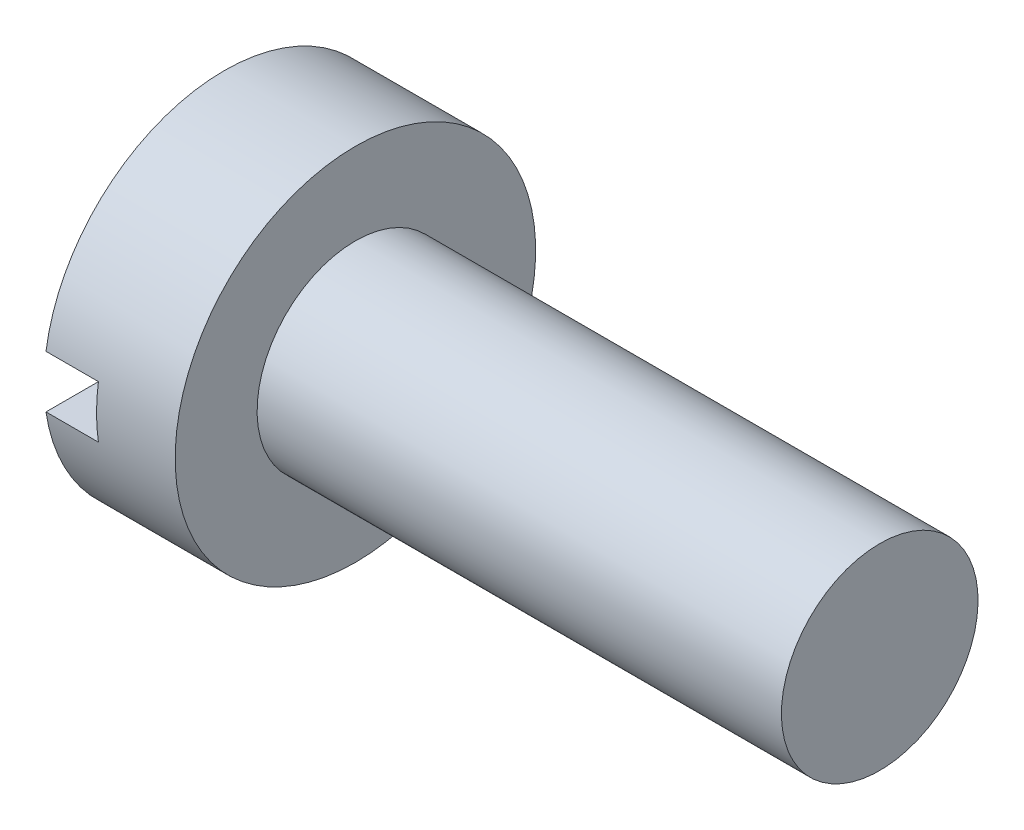
ISO-10303-21;
HEADER;
FILE_DESCRIPTION(('STEP AP214'),'2;1');
FILE_NAME('part.step','',(''),(''),'','','');
FILE_SCHEMA(('AUTOMOTIVE_DESIGN { 1 0 10303 214 1 1 1 1 }'));
ENDSEC;
DATA;
#1=APPLICATION_CONTEXT('core data for automotive mechanical design processes');
#2=APPLICATION_PROTOCOL_DEFINITION('international standard','automotive_design',2000,#1);
#3=PRODUCT_CONTEXT('',#1,'mechanical');
#4=PRODUCT('Part','Part','',(#3));
#5=PRODUCT_RELATED_PRODUCT_CATEGORY('part','',(#4));
#6=PRODUCT_DEFINITION_FORMATION('','',#4);
#7=PRODUCT_DEFINITION_CONTEXT('part definition',#1,'design');
#8=PRODUCT_DEFINITION('design','',#6,#7);
#9=PRODUCT_DEFINITION_SHAPE('','',#8);
#10=(LENGTH_UNIT() NAMED_UNIT(*) SI_UNIT(.MILLI.,.METRE.));
#11=(NAMED_UNIT(*) PLANE_ANGLE_UNIT() SI_UNIT($,.RADIAN.));
#12=(NAMED_UNIT(*) SI_UNIT($,.STERADIAN.) SOLID_ANGLE_UNIT());
#13=UNCERTAINTY_MEASURE_WITH_UNIT(LENGTH_MEASURE(1.E-05),#10,'distance_accuracy_value','');
#14=(GEOMETRIC_REPRESENTATION_CONTEXT(3) GLOBAL_UNCERTAINTY_ASSIGNED_CONTEXT((#13)) GLOBAL_UNIT_ASSIGNED_CONTEXT((#10,
#11,#12)) REPRESENTATION_CONTEXT('',''));
#15=CARTESIAN_POINT('',(0.,0.,0.));
#16=DIRECTION('',(0.,0.,1.));
#17=DIRECTION('',(1.,0.,0.));
#18=AXIS2_PLACEMENT_3D('',#15,#16,#17);
#19=CARTESIAN_POINT('',(0.,0.,0.));
#20=DIRECTION('',(-1.,0.,0.));
#21=DIRECTION('',(0.,-1.,0.));
#22=AXIS2_PLACEMENT_3D('',#19,#20,#21);
#23=PLANE('',#22);
#24=DIRECTION('',(0.,0.,-1.));
#25=VECTOR('',#24,1.);
#26=CARTESIAN_POINT('',(0.,0.399999999999997,-2.75));
#27=LINE('',#26,#25);
#28=CARTESIAN_POINT('',(0.,0.399999999999999,2.72075357208256));
#29=VERTEX_POINT('',#28);
#30=CARTESIAN_POINT('',(0.,0.399999999999997,-2.72075357208256));
#31=VERTEX_POINT('',#30);
#32=EDGE_CURVE('E82',#29,#31,#27,.T.);
#33=ORIENTED_EDGE('',*,*,#32,.F.);
#34=CARTESIAN_POINT('',(0.,0.,0.));
#35=DIRECTION('',(1.,0.,0.));
#36=DIRECTION('',(0.,1.,0.));
#37=AXIS2_PLACEMENT_3D('',#34,#35,#36);
#38=CIRCLE('',#37,2.75);
#39=EDGE_CURVE('E88',#31,#29,#38,.T.);
#40=ORIENTED_EDGE('',*,*,#39,.F.);
#41=EDGE_LOOP('',(#33,#40));
#42=FACE_BOUND('',#41,.T.);
#43=ADVANCED_FACE('F32',(#42),#23,.T.);
#44=DIRECTION('',(0.,0.,1.));
#45=VECTOR('',#44,1.);
#46=CARTESIAN_POINT('',(0.,-0.400000000000001,-2.75));
#47=LINE('',#46,#45);
#48=CARTESIAN_POINT('',(0.,-0.400000000000001,-2.72075357208256));
#49=VERTEX_POINT('',#48);
#50=CARTESIAN_POINT('',(0.,-0.399999999999999,2.72075357208256));
#51=VERTEX_POINT('',#50);
#52=EDGE_CURVE('E76',#49,#51,#47,.T.);
#53=ORIENTED_EDGE('',*,*,#52,.F.);
#54=EDGE_CURVE('E81',#51,#49,#38,.T.);
#55=ORIENTED_EDGE('',*,*,#54,.F.);
#56=EDGE_LOOP('',(#53,#55));
#57=FACE_BOUND('',#56,.T.);
#58=ADVANCED_FACE('F34',(#57),#23,.T.);
#59=CARTESIAN_POINT('',(10.,0.,0.));
#60=DIRECTION('',(1.,0.,0.));
#61=DIRECTION('',(0.,1.,0.));
#62=AXIS2_PLACEMENT_3D('',#59,#60,#61);
#63=CYLINDRICAL_SURFACE('',#62,2.75);
#64=DIRECTION('',(1.,0.,0.));
#65=VECTOR('',#64,1.);
#66=CARTESIAN_POINT('',(10.,0.399999999999997,-2.72075357208256));
#67=LINE('',#66,#65);
#68=CARTESIAN_POINT('',(0.8,0.399999999999997,-2.72075357208256));
#69=VERTEX_POINT('',#68);
#70=EDGE_CURVE('E11',#31,#69,#67,.T.);
#71=ORIENTED_EDGE('',*,*,#70,.F.);
#72=ORIENTED_EDGE('',*,*,#39,.T.);
#73=DIRECTION('',(1.,0.,0.));
#74=VECTOR('',#73,1.);
#75=CARTESIAN_POINT('',(10.,0.399999999999999,2.72075357208256));
#76=LINE('',#75,#74);
#77=CARTESIAN_POINT('',(0.8,0.399999999999999,2.72075357208256));
#78=VERTEX_POINT('',#77);
#79=EDGE_CURVE('E97',#78,#29,#76,.F.);
#80=ORIENTED_EDGE('',*,*,#79,.F.);
#81=CARTESIAN_POINT('',(0.8,0.,0.));
#82=DIRECTION('',(-1.,0.,0.));
#83=DIRECTION('',(0.,0.,1.));
#84=AXIS2_PLACEMENT_3D('',#81,#82,#83);
#85=CIRCLE('',#84,2.75);
#86=CARTESIAN_POINT('',(0.8,-0.399999999999999,2.72075357208256));
#87=VERTEX_POINT('',#86);
#88=EDGE_CURVE('E47',#78,#87,#85,.F.);
#89=ORIENTED_EDGE('',*,*,#88,.T.);
#90=DIRECTION('',(1.,0.,0.));
#91=VECTOR('',#90,1.);
#92=CARTESIAN_POINT('',(10.,-0.399999999999999,2.72075357208256));
#93=LINE('',#92,#91);
#94=EDGE_CURVE('E87',#51,#87,#93,.T.);
#95=ORIENTED_EDGE('',*,*,#94,.F.);
#96=ORIENTED_EDGE('',*,*,#54,.T.);
#97=DIRECTION('',(1.,0.,0.));
#98=VECTOR('',#97,1.);
#99=CARTESIAN_POINT('',(10.,-0.400000000000001,-2.72075357208256));
#100=LINE('',#99,#98);
#101=CARTESIAN_POINT('',(0.8,-0.400000000000001,-2.72075357208256));
#102=VERTEX_POINT('',#101);
#103=EDGE_CURVE('E40',#102,#49,#100,.F.);
#104=ORIENTED_EDGE('',*,*,#103,.F.);
#105=EDGE_CURVE('E55',#102,#69,#85,.F.);
#106=ORIENTED_EDGE('',*,*,#105,.T.);
#107=EDGE_LOOP('',(#71,#72,#80,#89,#95,#96,#104,#106));
#108=FACE_BOUND('',#107,.T.);
#109=CARTESIAN_POINT('',(2.,0.,0.));
#110=DIRECTION('',(1.,0.,0.));
#111=DIRECTION('',(0.,1.,0.));
#112=AXIS2_PLACEMENT_3D('',#109,#110,#111);
#113=CIRCLE('',#112,2.75);
#114=CARTESIAN_POINT('',(2.,2.75,0.));
#115=VERTEX_POINT('',#114);
#116=EDGE_CURVE('E92',#115,#115,#113,.T.);
#117=ORIENTED_EDGE('',*,*,#116,.F.);
#118=EDGE_LOOP('',(#117));
#119=FACE_BOUND('',#118,.T.);
#120=ADVANCED_FACE('F85',(#108,#119),#63,.T.);
#121=CARTESIAN_POINT('',(2.,2.75,0.));
#122=DIRECTION('',(1.,0.,0.));
#123=DIRECTION('',(0.,1.,0.));
#124=AXIS2_PLACEMENT_3D('',#121,#122,#123);
#125=PLANE('',#124);
#126=ORIENTED_EDGE('',*,*,#116,.T.);
#127=EDGE_LOOP('',(#126));
#128=FACE_BOUND('',#127,.T.);
#129=CARTESIAN_POINT('',(2.,0.,0.));
#130=DIRECTION('',(1.,0.,0.));
#131=DIRECTION('',(0.,1.,0.));
#132=AXIS2_PLACEMENT_3D('',#129,#130,#131);
#133=CIRCLE('',#132,1.5);
#134=CARTESIAN_POINT('',(2.,1.5,0.));
#135=VERTEX_POINT('',#134);
#136=EDGE_CURVE('E110',#135,#135,#133,.T.);
#137=ORIENTED_EDGE('',*,*,#136,.F.);
#138=EDGE_LOOP('',(#137));
#139=FACE_BOUND('',#138,.T.);
#140=ADVANCED_FACE('F117',(#128,#139),#125,.T.);
#141=CARTESIAN_POINT('',(10.,0.,0.));
#142=DIRECTION('',(1.,0.,0.));
#143=DIRECTION('',(0.,1.,0.));
#144=AXIS2_PLACEMENT_3D('',#141,#142,#143);
#145=CYLINDRICAL_SURFACE('',#144,1.5);
#146=ORIENTED_EDGE('',*,*,#136,.T.);
#147=EDGE_LOOP('',(#146));
#148=FACE_BOUND('',#147,.T.);
#149=CARTESIAN_POINT('',(10.,0.,0.));
#150=DIRECTION('',(1.,0.,0.));
#151=DIRECTION('',(0.,1.,0.));
#152=AXIS2_PLACEMENT_3D('',#149,#150,#151);
#153=CIRCLE('',#152,1.5);
#154=CARTESIAN_POINT('',(10.,1.5,0.));
#155=VERTEX_POINT('',#154);
#156=EDGE_CURVE('E108',#155,#155,#153,.T.);
#157=ORIENTED_EDGE('',*,*,#156,.F.);
#158=EDGE_LOOP('',(#157));
#159=FACE_BOUND('',#158,.T.);
#160=ADVANCED_FACE('F124',(#148,#159),#145,.T.);
#161=CARTESIAN_POINT('',(10.,1.5,0.));
#162=DIRECTION('',(1.,0.,0.));
#163=DIRECTION('',(0.,1.,0.));
#164=AXIS2_PLACEMENT_3D('',#161,#162,#163);
#165=PLANE('',#164);
#166=ORIENTED_EDGE('',*,*,#156,.T.);
#167=EDGE_LOOP('',(#166));
#168=FACE_BOUND('',#167,.T.);
#169=ADVANCED_FACE('F149',(#168),#165,.T.);
#170=CARTESIAN_POINT('',(0.8,0.399999999999997,-2.75));
#171=DIRECTION('',(0.,1.,0.));
#172=DIRECTION('',(0.,0.,1.));
#173=AXIS2_PLACEMENT_3D('',#170,#171,#172);
#174=PLANE('',#173);
#175=ORIENTED_EDGE('',*,*,#79,.T.);
#176=ORIENTED_EDGE('',*,*,#32,.T.);
#177=ORIENTED_EDGE('',*,*,#70,.T.);
#178=DIRECTION('',(0.,0.,-1.));
#179=VECTOR('',#178,1.);
#180=CARTESIAN_POINT('',(0.8,0.399999999999997,-2.75));
#181=LINE('',#180,#179);
#182=EDGE_CURVE('E104',#78,#69,#181,.T.);
#183=ORIENTED_EDGE('',*,*,#182,.F.);
#184=EDGE_LOOP('',(#175,#176,#177,#183));
#185=FACE_BOUND('',#184,.T.);
#186=ADVANCED_FACE('F144',(#185),#174,.F.);
#187=CARTESIAN_POINT('',(0.8,-0.400000000000001,-2.75));
#188=DIRECTION('',(0.,-1.,0.));
#189=DIRECTION('',(0.,0.,-1.));
#190=AXIS2_PLACEMENT_3D('',#187,#188,#189);
#191=PLANE('',#190);
#192=ORIENTED_EDGE('',*,*,#103,.T.);
#193=ORIENTED_EDGE('',*,*,#52,.T.);
#194=ORIENTED_EDGE('',*,*,#94,.T.);
#195=DIRECTION('',(0.,0.,1.));
#196=VECTOR('',#195,1.);
#197=CARTESIAN_POINT('',(0.8,-0.400000000000001,-2.75));
#198=LINE('',#197,#196);
#199=EDGE_CURVE('E77',#102,#87,#198,.T.);
#200=ORIENTED_EDGE('',*,*,#199,.F.);
#201=EDGE_LOOP('',(#192,#193,#194,#200));
#202=FACE_BOUND('',#201,.T.);
#203=ADVANCED_FACE('F75',(#202),#191,.F.);
#204=CARTESIAN_POINT('',(0.8,0.,0.));
#205=DIRECTION('',(-1.,0.,0.));
#206=DIRECTION('',(0.,0.,1.));
#207=AXIS2_PLACEMENT_3D('',#204,#205,#206);
#208=PLANE('',#207);
#209=ORIENTED_EDGE('',*,*,#199,.T.);
#210=ORIENTED_EDGE('',*,*,#88,.F.);
#211=ORIENTED_EDGE('',*,*,#182,.T.);
#212=ORIENTED_EDGE('',*,*,#105,.F.);
#213=EDGE_LOOP('',(#209,#210,#211,#212));
#214=FACE_BOUND('',#213,.T.);
#215=ADVANCED_FACE('F159',(#214),#208,.T.);
#216=CLOSED_SHELL('',(#43,#58,#120,#140,#160,#169,#186,#203,#215));
#217=MANIFOLD_SOLID_BREP('B2',#216);
#218=ADVANCED_BREP_SHAPE_REPRESENTATION('',(#18,#217),#14);
#219=SHAPE_DEFINITION_REPRESENTATION(#9,#218);
ENDSEC;
END-ISO-10303-21;
